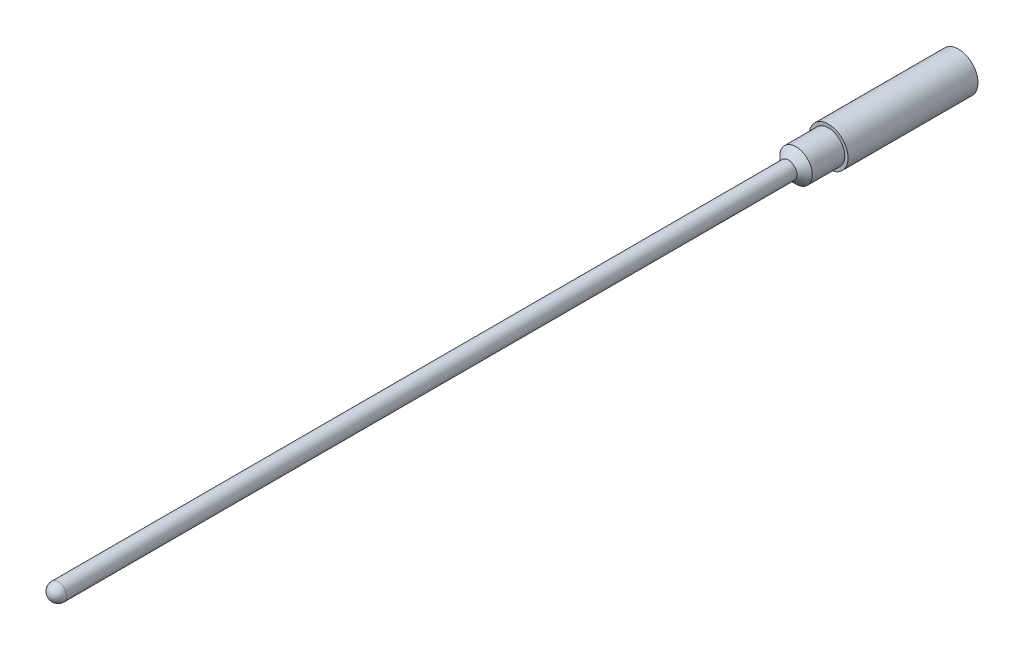
ISO-10303-21;
HEADER;
FILE_DESCRIPTION(('STEP AP214'),'2;1');
FILE_NAME('part.step','',(''),(''),'','','');
FILE_SCHEMA(('AUTOMOTIVE_DESIGN { 1 0 10303 214 1 1 1 1 }'));
ENDSEC;
DATA;
#1=APPLICATION_CONTEXT('core data for automotive mechanical design processes');
#2=APPLICATION_PROTOCOL_DEFINITION('international standard','automotive_design',2000,#1);
#3=PRODUCT_CONTEXT('',#1,'mechanical');
#4=PRODUCT('Part','Part','',(#3));
#5=PRODUCT_RELATED_PRODUCT_CATEGORY('part','',(#4));
#6=PRODUCT_DEFINITION_FORMATION('','',#4);
#7=PRODUCT_DEFINITION_CONTEXT('part definition',#1,'design');
#8=PRODUCT_DEFINITION('design','',#6,#7);
#9=PRODUCT_DEFINITION_SHAPE('','',#8);
#10=(LENGTH_UNIT() NAMED_UNIT(*) SI_UNIT(.MILLI.,.METRE.));
#11=(NAMED_UNIT(*) PLANE_ANGLE_UNIT() SI_UNIT($,.RADIAN.));
#12=(NAMED_UNIT(*) SI_UNIT($,.STERADIAN.) SOLID_ANGLE_UNIT());
#13=UNCERTAINTY_MEASURE_WITH_UNIT(LENGTH_MEASURE(1.E-05),#10,'distance_accuracy_value','');
#14=(GEOMETRIC_REPRESENTATION_CONTEXT(3) GLOBAL_UNCERTAINTY_ASSIGNED_CONTEXT((#13)) GLOBAL_UNIT_ASSIGNED_CONTEXT((#10,
#11,#12)) REPRESENTATION_CONTEXT('',''));
#15=CARTESIAN_POINT('',(0.,0.,0.));
#16=DIRECTION('',(0.,0.,1.));
#17=DIRECTION('',(1.,0.,0.));
#18=AXIS2_PLACEMENT_3D('',#15,#16,#17);
#19=CARTESIAN_POINT('',(0.,125.,62.8424));
#20=DIRECTION('',(0.,0.,-1.));
#21=DIRECTION('',(-1.,0.,0.));
#22=AXIS2_PLACEMENT_3D('',#19,#20,#21);
#23=CYLINDRICAL_SURFACE('',#22,1.50000000000002);
#24=CARTESIAN_POINT('',(0.,125.,62.8424));
#25=DIRECTION('',(0.,0.,-1.));
#26=DIRECTION('',(-1.,0.,0.));
#27=AXIS2_PLACEMENT_3D('',#24,#25,#26);
#28=CIRCLE('',#27,1.50000000000002);
#29=CARTESIAN_POINT('',(-1.50000000000002,125.,62.8424));
#30=VERTEX_POINT('',#29);
#31=EDGE_CURVE('P0_E11',#30,#30,#28,.F.);
#32=ORIENTED_EDGE('',*,*,#31,.T.);
#33=EDGE_LOOP('',(#32));
#34=FACE_BOUND('',#33,.T.);
#35=CARTESIAN_POINT('',(0.,125.,52.8424000000003));
#36=DIRECTION('',(0.,0.,-1.));
#37=DIRECTION('',(0.,-1.,0.));
#38=AXIS2_PLACEMENT_3D('',#35,#36,#37);
#39=CIRCLE('',#38,1.50000000000002);
#40=CARTESIAN_POINT('',(0.,123.5,52.8424000000003));
#41=VERTEX_POINT('',#40);
#42=EDGE_CURVE('P0_E23',#41,#41,#39,.T.);
#43=ORIENTED_EDGE('',*,*,#42,.T.);
#44=EDGE_LOOP('',(#43));
#45=FACE_BOUND('',#44,.T.);
#46=ADVANCED_FACE('P0_F16',(#34,#45),#23,.F.);
#47=CARTESIAN_POINT('',(1.596591791956,126.5923134515,62.8424));
#48=DIRECTION('',(0.,0.,-1.));
#49=DIRECTION('',(0.,-1.,0.));
#50=AXIS2_PLACEMENT_3D('',#47,#48,#49);
#51=PLANE('',#50);
#52=CARTESIAN_POINT('',(0.,126.249999999965,62.8424));
#53=CARTESIAN_POINT('',(-0.121847652041307,126.250644113426,62.8424));
#54=CARTESIAN_POINT('',(-0.243945333798188,126.226217554944,62.8424));
#55=CARTESIAN_POINT('',(-0.36366922825702,126.202265890443,62.8424));
#56=CARTESIAN_POINT('',(-0.47831666850732,126.154748414606,62.8424));
#57=CARTESIAN_POINT('',(-0.591858356230295,126.107689235692,62.8424));
#58=CARTESIAN_POINT('',(-0.694454184528535,126.039308654632,62.8424));
#59=CARTESIAN_POINT('',(-0.796177142704628,125.971509845435,62.8424));
#60=CARTESIAN_POINT('',(-0.883868174369873,125.883884191523,62.8424));
#61=CARTESIAN_POINT('',(-0.970724854979047,125.797092266619,62.8424));
#62=CARTESIAN_POINT('',(-1.03932928350558,125.694457294566,62.8424));
#63=CARTESIAN_POINT('',(-1.10740351666319,125.592615516014,62.8424));
#64=CARTESIAN_POINT('',(-1.15483270719274,125.478340896633,62.8424));
#65=CARTESIAN_POINT('',(-1.20177368295137,125.365242568824,62.8424));
#66=CARTESIAN_POINT('',(-1.22595365568335,125.243861627743,62.8424));
#67=CARTESIAN_POINT('',(-1.24994533943904,125.123425877685,62.8424));
#68=CARTESIAN_POINT('',(-1.25000000000033,125.,62.8424));
#69=CARTESIAN_POINT('',(-1.25005417268281,124.877675773475,62.8424));
#70=CARTESIAN_POINT('',(-1.22595365568335,124.756138372257,62.8424));
#71=CARTESIAN_POINT('',(-1.20209264020343,124.635808762235,62.8424));
#72=CARTESIAN_POINT('',(-1.15483270719274,124.521659103367,62.8424));
#73=CARTESIAN_POINT('',(-1.10792527012553,124.408360848409,62.8424));
#74=CARTESIAN_POINT('',(-1.03932928350558,124.305542705434,62.8424));
#75=CARTESIAN_POINT('',(-0.971423871697238,124.203759661205,62.8424));
#76=CARTESIAN_POINT('',(-0.883868174369873,124.116115808477,62.8424));
#77=CARTESIAN_POINT('',(-0.797027687726353,124.029187886543,62.8424));
#78=CARTESIAN_POINT('',(-0.694454184528535,123.960691345368,62.8424));
#79=CARTESIAN_POINT('',(-0.592834827752486,123.892831964158,62.8424));
#80=CARTESIAN_POINT('',(-0.47831666850732,123.845251585394,62.8424));
#81=CARTESIAN_POINT('',(-0.364727774548991,123.798057300805,62.8424));
#82=CARTESIAN_POINT('',(-0.243945333798189,123.773782445056,62.8424));
#83=CARTESIAN_POINT('',(-0.184047620935341,123.761744202325,62.8424));
#84=CARTESIAN_POINT('',(-0.122628178060295,123.755698130901,62.8424));
#85=CARTESIAN_POINT('',(-0.0614437573284797,123.749675194833,62.8424));
#86=CARTESIAN_POINT('',(0.,123.750000000035,62.8424));
#87=B_SPLINE_CURVE_WITH_KNOTS('',2,(#52,#53,#54,#55,#56,#57,#58,#59,#60,#61,#62,#63,#64,#65,#66,
#67,#68,#69,#70,#71,#72,#73,#74,#75,#76,#77,#78,#79,#80,#81,#82,#83,#84,#85,#86),.UNSPECIFIED.,
.F.,.F.,(3,2,2,2,2,2,2,2,2,2,2,2,2,2,2,2,2,3),(0.,0.0625,0.125,0.1875,0.25,0.3125,0.375,0.4375,
0.5,0.5625,0.625,0.6875,0.75,0.8125,0.875,0.9375,0.96875,1.),.UNSPECIFIED.);
#88=CARTESIAN_POINT('',(0.,126.249999999965,62.8424));
#89=VERTEX_POINT('',#88);
#90=CARTESIAN_POINT('',(0.,123.750000000035,62.8424));
#91=VERTEX_POINT('',#90);
#92=EDGE_CURVE('P0_E29',#89,#91,#87,.T.);
#93=ORIENTED_EDGE('',*,*,#92,.T.);
#94=CARTESIAN_POINT('',(0.,123.750000000035,62.8424));
#95=CARTESIAN_POINT('',(0.121847652048904,123.749355886574,62.8424));
#96=CARTESIAN_POINT('',(0.243945333798188,123.773782445056,62.8424));
#97=CARTESIAN_POINT('',(0.363669228264283,123.79773410956,62.8424));
#98=CARTESIAN_POINT('',(0.47831666850732,123.845251585394,62.8424));
#99=CARTESIAN_POINT('',(0.591858356230167,123.892310764308,62.8424));
#100=CARTESIAN_POINT('',(0.694454184528535,123.960691345368,62.8424));
#101=CARTESIAN_POINT('',(0.796177142695193,124.028490154559,62.8424));
#102=CARTESIAN_POINT('',(0.883868174369873,124.116115808477,62.8424));
#103=CARTESIAN_POINT('',(0.970724854972796,124.202907733371,62.8424));
#104=CARTESIAN_POINT('',(1.03932928350558,124.305542705434,62.8424));
#105=CARTESIAN_POINT('',(1.10740351666306,124.407384483985,62.8424));
#106=CARTESIAN_POINT('',(1.15483270719274,124.521659103367,62.8424));
#107=CARTESIAN_POINT('',(1.20177368295138,124.634757431176,62.8424));
#108=CARTESIAN_POINT('',(1.22595365568335,124.756138372257,62.8424));
#109=CARTESIAN_POINT('',(1.24994533943904,124.876574122316,62.8424));
#110=CARTESIAN_POINT('',(1.25000000000033,125.,62.8424));
#111=CARTESIAN_POINT('',(1.25005417268281,125.122324226524,62.8424));
#112=CARTESIAN_POINT('',(1.22595365568335,125.243861627743,62.8424));
#113=CARTESIAN_POINT('',(1.20209264020348,125.364191237765,62.8424));
#114=CARTESIAN_POINT('',(1.15483270719274,125.478340896633,62.8424));
#115=CARTESIAN_POINT('',(1.10792527012895,125.591639151583,62.8424));
#116=CARTESIAN_POINT('',(1.03932928350558,125.694457294566,62.8424));
#117=CARTESIAN_POINT('',(0.971423871703627,125.796240338789,62.8424));
#118=CARTESIAN_POINT('',(0.883868174369873,125.883884191523,62.8424));
#119=CARTESIAN_POINT('',(0.797027687726522,125.970812113457,62.8424));
#120=CARTESIAN_POINT('',(0.694454184528535,126.039308654632,62.8424));
#121=CARTESIAN_POINT('',(0.592834827752694,126.107168035842,62.8424));
#122=CARTESIAN_POINT('',(0.47831666850732,126.154748414606,62.8424));
#123=CARTESIAN_POINT('',(0.364727774549108,126.201942699195,62.8424));
#124=CARTESIAN_POINT('',(0.243945333798189,126.226217554944,62.8424));
#125=CARTESIAN_POINT('',(0.184047620935353,126.238255797675,62.8424));
#126=CARTESIAN_POINT('',(0.122628178060295,126.244301869099,62.8424));
#127=CARTESIAN_POINT('',(0.0614437573284677,126.250324805167,62.8424));
#128=CARTESIAN_POINT('',(0.,126.249999999965,62.8424));
#129=B_SPLINE_CURVE_WITH_KNOTS('',2,(#94,#95,#96,#97,#98,#99,#100,#101,#102,#103,#104,#105,#106,
#107,#108,#109,#110,#111,#112,#113,#114,#115,#116,#117,#118,#119,#120,#121,#122,#123,#124,#125,
#126,#127,#128),.UNSPECIFIED.,.F.,.F.,(3,2,2,2,2,2,2,2,2,2,2,2,2,2,2,2,2,3),(0.,0.0625,0.125,
0.1875,0.25,0.3125,0.375,0.4375,0.5,0.5625,0.625,0.6875,0.75,0.8125,0.875,0.9375,0.96875,1.),.UNSPECIFIED.);
#130=EDGE_CURVE('P0_E32',#91,#89,#129,.T.);
#131=ORIENTED_EDGE('',*,*,#130,.T.);
#132=EDGE_LOOP('',(#93,#131));
#133=FACE_BOUND('',#132,.T.);
#134=ORIENTED_EDGE('',*,*,#31,.F.);
#135=EDGE_LOOP('',(#134));
#136=FACE_BOUND('',#135,.T.);
#137=ADVANCED_FACE('P0_F17',(#133,#136),#51,.T.);
#138=OPEN_SHELL('',(#46,#137));
#139=SHELL_BASED_SURFACE_MODEL('P0_B1',(#138));
#140=CARTESIAN_POINT('',(-1.342313451544,126.3423134515,52.8424));
#141=DIRECTION('',(0.,0.,1.));
#142=DIRECTION('',(0.,-1.,0.));
#143=AXIS2_PLACEMENT_3D('',#140,#141,#142);
#144=PLANE('',#143);
#145=CARTESIAN_POINT('',(0.,125.,52.8424));
#146=DIRECTION('',(0.,0.,1.));
#147=DIRECTION('',(1.,0.,0.));
#148=AXIS2_PLACEMENT_3D('',#145,#146,#147);
#149=CIRCLE('',#148,1.25000000000002);
#150=CARTESIAN_POINT('',(1.25000000000002,125.,52.8424));
#151=VERTEX_POINT('',#150);
#152=EDGE_CURVE('P1_E19',#151,#151,#149,.F.);
#153=ORIENTED_EDGE('',*,*,#152,.T.);
#154=EDGE_LOOP('',(#153));
#155=FACE_BOUND('',#154,.T.);
#156=ADVANCED_FACE('P1_F16',(#155),#144,.F.);
#157=CARTESIAN_POINT('',(0.,125.,52.8424));
#158=DIRECTION('',(0.,0.,1.));
#159=DIRECTION('',(1.,0.,0.));
#160=AXIS2_PLACEMENT_3D('',#157,#158,#159);
#161=CYLINDRICAL_SURFACE('',#160,1.25000000000002);
#162=ORIENTED_EDGE('',*,*,#152,.F.);
#163=EDGE_LOOP('',(#162));
#164=FACE_BOUND('',#163,.T.);
#165=CARTESIAN_POINT('',(0.,125.,65.3424000000013));
#166=DIRECTION('',(0.,0.,-1.));
#167=DIRECTION('',(0.,1.,0.));
#168=AXIS2_PLACEMENT_3D('',#165,#166,#167);
#169=CIRCLE('',#168,1.25000000001504);
#170=CARTESIAN_POINT('',(0.,126.250000000015,65.3424000000013));
#171=VERTEX_POINT('',#170);
#172=EDGE_CURVE('P1_E45',#171,#171,#169,.T.);
#173=ORIENTED_EDGE('',*,*,#172,.T.);
#174=EDGE_LOOP('',(#173));
#175=FACE_BOUND('',#174,.T.);
#176=ADVANCED_FACE('P1_F53',(#164,#175),#161,.T.);
#177=CARTESIAN_POINT('',(0.,125.,65.9319999999987));
#178=DIRECTION('',(0.,0.,-1.));
#179=DIRECTION('',(-1.,0.,0.));
#180=AXIS2_PLACEMENT_3D('',#177,#178,#179);
#181=CONICAL_SURFACE('',#180,0.660399999984906,0.785398163425282);
#182=ORIENTED_EDGE('',*,*,#172,.F.);
#183=EDGE_LOOP('',(#182));
#184=FACE_BOUND('',#183,.T.);
#185=CARTESIAN_POINT('',(0.,125.,65.932));
#186=DIRECTION('',(0.,0.,1.));
#187=DIRECTION('',(0.,-1.,0.));
#188=AXIS2_PLACEMENT_3D('',#185,#186,#187);
#189=CIRCLE('',#188,0.660400000000019);
#190=CARTESIAN_POINT('',(0.,124.3396,65.932));
#191=VERTEX_POINT('',#190);
#192=EDGE_CURVE('P1_E23',#191,#191,#189,.F.);
#193=ORIENTED_EDGE('',*,*,#192,.T.);
#194=EDGE_LOOP('',(#193));
#195=FACE_BOUND('',#194,.T.);
#196=ADVANCED_FACE('P1_F36',(#184,#195),#181,.T.);
#197=CARTESIAN_POINT('',(0.,125.,65.932));
#198=DIRECTION('',(0.,0.,1.));
#199=DIRECTION('',(1.,0.,0.));
#200=AXIS2_PLACEMENT_3D('',#197,#198,#199);
#201=CYLINDRICAL_SURFACE('',#200,0.660400000000019);
#202=CARTESIAN_POINT('',(0.,125.,122.1072));
#203=DIRECTION('',(0.,0.,1.));
#204=DIRECTION('',(0.,-1.,0.));
#205=AXIS2_PLACEMENT_3D('',#202,#203,#204);
#206=CIRCLE('',#205,0.660400000000005);
#207=CARTESIAN_POINT('',(0.,124.3396,122.1072));
#208=VERTEX_POINT('',#207);
#209=EDGE_CURVE('P1_E11',#208,#208,#206,.F.);
#210=ORIENTED_EDGE('',*,*,#209,.T.);
#211=EDGE_LOOP('',(#210));
#212=FACE_BOUND('',#211,.T.);
#213=ORIENTED_EDGE('',*,*,#192,.F.);
#214=EDGE_LOOP('',(#213));
#215=FACE_BOUND('',#214,.T.);
#216=ADVANCED_FACE('P1_F29',(#212,#215),#201,.T.);
#217=CARTESIAN_POINT('',(0.,125.,122.1072));
#218=DIRECTION('',(0.,0.,1.));
#219=DIRECTION('',(0.,1.,0.));
#220=AXIS2_PLACEMENT_3D('',#217,#218,#219);
#221=SPHERICAL_SURFACE('',#220,0.6604);
#222=ORIENTED_EDGE('',*,*,#209,.F.);
#223=EDGE_LOOP('',(#222));
#224=FACE_BOUND('',#223,.T.);
#225=CARTESIAN_POINT('',(0.,125.,122.7676));
#226=VERTEX_POINT('',#225);
#227=VERTEX_LOOP('',#226);
#228=FACE_BOUND('',#227,.T.);
#229=ADVANCED_FACE('P1_F27',(#224,#228),#221,.T.);
#230=CLOSED_SHELL('',(#156,#176,#196,#216,#229));
#231=MANIFOLD_SOLID_BREP('P1_B1',#230);
#232=ADVANCED_BREP_SHAPE_REPRESENTATION('',(#18,#231),#14);
#233=MANIFOLD_SURFACE_SHAPE_REPRESENTATION('',(#18,#139),#14);
#234=SHAPE_REPRESENTATION('',(#18),#14);
#235=SHAPE_DEFINITION_REPRESENTATION(#9,#234);
#236=SHAPE_REPRESENTATION_RELATIONSHIP('','',#234,#232);
#237=SHAPE_REPRESENTATION_RELATIONSHIP('','',#234,#233);
ENDSEC;
END-ISO-10303-21;
